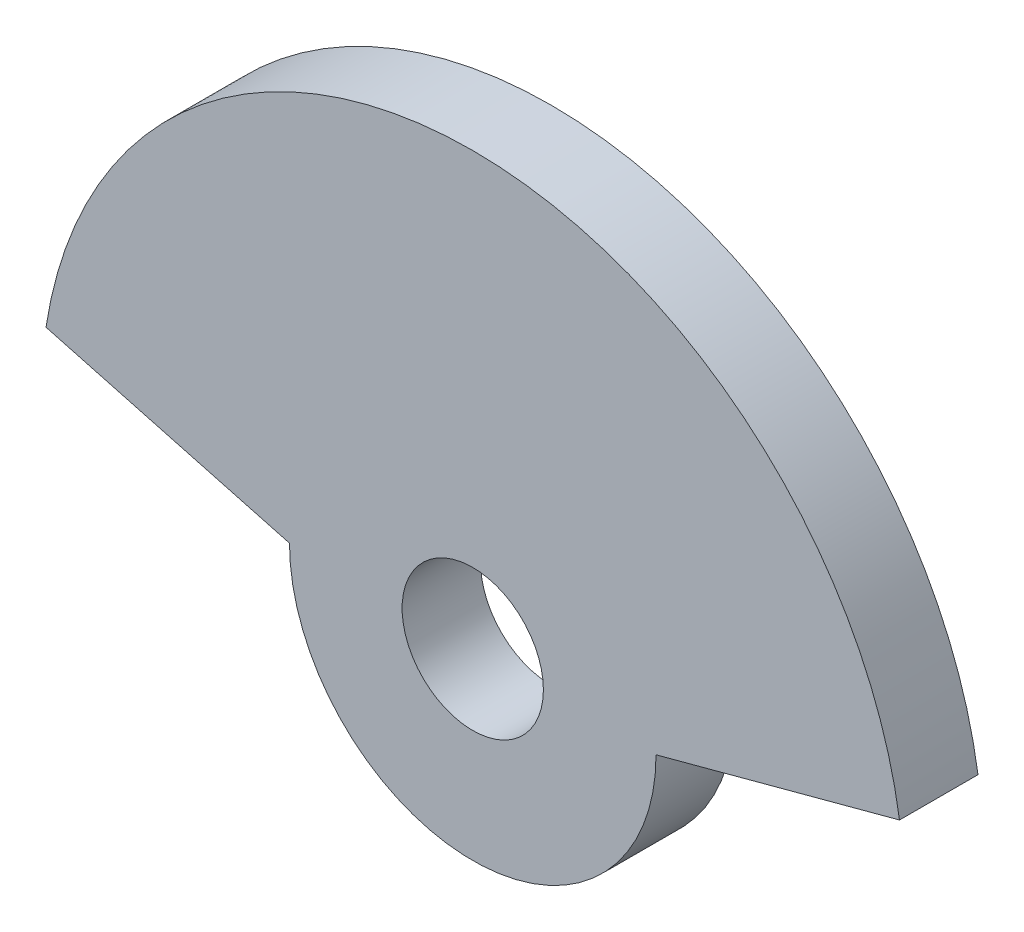
ISO-10303-21;
HEADER;
FILE_DESCRIPTION(('STEP AP214'),'2;1');
FILE_NAME('part.step','',(''),(''),'','','');
FILE_SCHEMA(('AUTOMOTIVE_DESIGN { 1 0 10303 214 1 1 1 1 }'));
ENDSEC;
DATA;
#1=APPLICATION_CONTEXT('core data for automotive mechanical design processes');
#2=APPLICATION_PROTOCOL_DEFINITION('international standard','automotive_design',2000,#1);
#3=PRODUCT_CONTEXT('',#1,'mechanical');
#4=PRODUCT('Part','Part','',(#3));
#5=PRODUCT_RELATED_PRODUCT_CATEGORY('part','',(#4));
#6=PRODUCT_DEFINITION_FORMATION('','',#4);
#7=PRODUCT_DEFINITION_CONTEXT('part definition',#1,'design');
#8=PRODUCT_DEFINITION('design','',#6,#7);
#9=PRODUCT_DEFINITION_SHAPE('','',#8);
#10=(LENGTH_UNIT() NAMED_UNIT(*) SI_UNIT(.MILLI.,.METRE.));
#11=(NAMED_UNIT(*) PLANE_ANGLE_UNIT() SI_UNIT($,.RADIAN.));
#12=(NAMED_UNIT(*) SI_UNIT($,.STERADIAN.) SOLID_ANGLE_UNIT());
#13=UNCERTAINTY_MEASURE_WITH_UNIT(LENGTH_MEASURE(1.E-05),#10,'distance_accuracy_value','');
#14=(GEOMETRIC_REPRESENTATION_CONTEXT(3) GLOBAL_UNCERTAINTY_ASSIGNED_CONTEXT((#13)) GLOBAL_UNIT_ASSIGNED_CONTEXT((#10,
#11,#12)) REPRESENTATION_CONTEXT('',''));
#15=CARTESIAN_POINT('',(0.,0.,0.));
#16=DIRECTION('',(0.,0.,1.));
#17=DIRECTION('',(1.,0.,0.));
#18=AXIS2_PLACEMENT_3D('',#15,#16,#17);
#19=CARTESIAN_POINT('',(0.,0.,10.));
#20=DIRECTION('',(0.,0.,1.));
#21=DIRECTION('',(1.,0.,0.));
#22=AXIS2_PLACEMENT_3D('',#19,#20,#21);
#23=PLANE('',#22);
#24=CARTESIAN_POINT('',(0.,0.,10.));
#25=DIRECTION('',(0.,0.,1.));
#26=DIRECTION('',(1.,0.,0.));
#27=AXIS2_PLACEMENT_3D('',#24,#25,#26);
#28=CIRCLE('',#27,23.35);
#29=CARTESIAN_POINT('',(-23.35,0.,10.));
#30=VERTEX_POINT('',#29);
#31=CARTESIAN_POINT('',(23.35,0.,10.));
#32=VERTEX_POINT('',#31);
#33=EDGE_CURVE('E88',#30,#32,#28,.T.);
#34=ORIENTED_EDGE('',*,*,#33,.T.);
#35=DIRECTION('',(0.965925826289069,0.258819045102518,0.));
#36=VECTOR('',#35,1.);
#37=CARTESIAN_POINT('',(23.35,0.,10.));
#38=LINE('',#37,#36);
#39=CARTESIAN_POINT('',(54.368386356424,8.31135157472027,10.));
#40=VERTEX_POINT('',#39);
#41=EDGE_CURVE('E83',#32,#40,#38,.T.);
#42=ORIENTED_EDGE('',*,*,#41,.T.);
#43=CARTESIAN_POINT('',(0.,0.,10.));
#44=DIRECTION('',(0.,0.,1.));
#45=DIRECTION('',(1.,0.,0.));
#46=AXIS2_PLACEMENT_3D('',#43,#44,#45);
#47=CIRCLE('',#46,55.);
#48=CARTESIAN_POINT('',(-54.368386356424,8.31135157472027,10.));
#49=VERTEX_POINT('',#48);
#50=EDGE_CURVE('E86',#40,#49,#47,.T.);
#51=ORIENTED_EDGE('',*,*,#50,.T.);
#52=DIRECTION('',(0.965925826289069,-0.258819045102518,0.));
#53=VECTOR('',#52,1.);
#54=CARTESIAN_POINT('',(-23.35,0.,10.));
#55=LINE('',#54,#53);
#56=EDGE_CURVE('E53',#49,#30,#55,.T.);
#57=ORIENTED_EDGE('',*,*,#56,.T.);
#58=EDGE_LOOP('',(#34,#42,#51,#57));
#59=FACE_BOUND('',#58,.T.);
#60=CARTESIAN_POINT('',(0.,0.,10.));
#61=DIRECTION('',(0.,0.,1.));
#62=DIRECTION('',(1.,0.,0.));
#63=AXIS2_PLACEMENT_3D('',#60,#61,#62);
#64=CIRCLE('',#63,9.);
#65=CARTESIAN_POINT('',(9.,0.,10.));
#66=VERTEX_POINT('',#65);
#67=EDGE_CURVE('E103',#66,#66,#64,.T.);
#68=ORIENTED_EDGE('',*,*,#67,.F.);
#69=EDGE_LOOP('',(#68));
#70=FACE_BOUND('',#69,.T.);
#71=ADVANCED_FACE('F36',(#59,#70),#23,.T.);
#72=CARTESIAN_POINT('',(0.,0.,0.));
#73=DIRECTION('',(0.,0.,1.));
#74=DIRECTION('',(1.,0.,0.));
#75=AXIS2_PLACEMENT_3D('',#72,#73,#74);
#76=PLANE('',#75);
#77=CARTESIAN_POINT('',(0.,0.,0.));
#78=DIRECTION('',(0.,0.,1.));
#79=DIRECTION('',(1.,0.,0.));
#80=AXIS2_PLACEMENT_3D('',#77,#78,#79);
#81=CIRCLE('',#80,23.35);
#82=CARTESIAN_POINT('',(-23.35,0.,0.));
#83=VERTEX_POINT('',#82);
#84=CARTESIAN_POINT('',(23.35,0.,0.));
#85=VERTEX_POINT('',#84);
#86=EDGE_CURVE('E100',#83,#85,#81,.T.);
#87=ORIENTED_EDGE('',*,*,#86,.F.);
#88=DIRECTION('',(0.965925826289069,-0.258819045102518,0.));
#89=VECTOR('',#88,1.);
#90=CARTESIAN_POINT('',(-23.35,0.,0.));
#91=LINE('',#90,#89);
#92=CARTESIAN_POINT('',(-54.368386356424,8.31135157472027,0.));
#93=VERTEX_POINT('',#92);
#94=EDGE_CURVE('E76',#93,#83,#91,.T.);
#95=ORIENTED_EDGE('',*,*,#94,.F.);
#96=CARTESIAN_POINT('',(0.,0.,0.));
#97=DIRECTION('',(0.,0.,1.));
#98=DIRECTION('',(1.,0.,0.));
#99=AXIS2_PLACEMENT_3D('',#96,#97,#98);
#100=CIRCLE('',#99,55.);
#101=CARTESIAN_POINT('',(54.368386356424,8.31135157472027,0.));
#102=VERTEX_POINT('',#101);
#103=EDGE_CURVE('E70',#102,#93,#100,.T.);
#104=ORIENTED_EDGE('',*,*,#103,.F.);
#105=DIRECTION('',(0.965925826289069,0.258819045102518,0.));
#106=VECTOR('',#105,1.);
#107=CARTESIAN_POINT('',(23.35,0.,0.));
#108=LINE('',#107,#106);
#109=EDGE_CURVE('E92',#85,#102,#108,.T.);
#110=ORIENTED_EDGE('',*,*,#109,.F.);
#111=EDGE_LOOP('',(#87,#95,#104,#110));
#112=FACE_BOUND('',#111,.T.);
#113=CARTESIAN_POINT('',(0.,0.,0.));
#114=DIRECTION('',(0.,0.,1.));
#115=DIRECTION('',(1.,0.,0.));
#116=AXIS2_PLACEMENT_3D('',#113,#114,#115);
#117=CIRCLE('',#116,9.);
#118=CARTESIAN_POINT('',(9.,0.,0.));
#119=VERTEX_POINT('',#118);
#120=EDGE_CURVE('E115',#119,#119,#117,.T.);
#121=ORIENTED_EDGE('',*,*,#120,.T.);
#122=EDGE_LOOP('',(#121));
#123=FACE_BOUND('',#122,.T.);
#124=ADVANCED_FACE('F111',(#112,#123),#76,.F.);
#125=CARTESIAN_POINT('',(0.,0.,10.));
#126=DIRECTION('',(0.,0.,-1.));
#127=DIRECTION('',(-1.,0.,0.));
#128=AXIS2_PLACEMENT_3D('',#125,#126,#127);
#129=CYLINDRICAL_SURFACE('',#128,23.35);
#130=ORIENTED_EDGE('',*,*,#86,.T.);
#131=DIRECTION('',(0.,0.,-1.));
#132=VECTOR('',#131,1.);
#133=CARTESIAN_POINT('',(23.35,0.,10.));
#134=LINE('',#133,#132);
#135=EDGE_CURVE('E11',#32,#85,#134,.T.);
#136=ORIENTED_EDGE('',*,*,#135,.F.);
#137=ORIENTED_EDGE('',*,*,#33,.F.);
#138=DIRECTION('',(0.,0.,-1.));
#139=VECTOR('',#138,1.);
#140=CARTESIAN_POINT('',(-23.35,0.,10.));
#141=LINE('',#140,#139);
#142=EDGE_CURVE('E96',#30,#83,#141,.T.);
#143=ORIENTED_EDGE('',*,*,#142,.T.);
#144=EDGE_LOOP('',(#130,#136,#137,#143));
#145=FACE_BOUND('',#144,.T.);
#146=ADVANCED_FACE('F38',(#145),#129,.T.);
#147=CARTESIAN_POINT('',(23.35,0.,10.));
#148=DIRECTION('',(-0.258819045102518,0.965925826289069,0.));
#149=DIRECTION('',(-0.965925826289069,-0.258819045102518,0.));
#150=AXIS2_PLACEMENT_3D('',#147,#148,#149);
#151=PLANE('',#150);
#152=ORIENTED_EDGE('',*,*,#109,.T.);
#153=DIRECTION('',(0.,0.,-1.));
#154=VECTOR('',#153,1.);
#155=CARTESIAN_POINT('',(54.368386356424,8.31135157472027,10.));
#156=LINE('',#155,#154);
#157=EDGE_CURVE('E45',#40,#102,#156,.T.);
#158=ORIENTED_EDGE('',*,*,#157,.F.);
#159=ORIENTED_EDGE('',*,*,#41,.F.);
#160=ORIENTED_EDGE('',*,*,#135,.T.);
#161=EDGE_LOOP('',(#152,#158,#159,#160));
#162=FACE_BOUND('',#161,.T.);
#163=ADVANCED_FACE('F91',(#162),#151,.F.);
#164=CARTESIAN_POINT('',(0.,0.,10.));
#165=DIRECTION('',(0.,0.,-1.));
#166=DIRECTION('',(-1.,0.,0.));
#167=AXIS2_PLACEMENT_3D('',#164,#165,#166);
#168=CYLINDRICAL_SURFACE('',#167,55.);
#169=ORIENTED_EDGE('',*,*,#103,.T.);
#170=DIRECTION('',(0.,0.,-1.));
#171=VECTOR('',#170,1.);
#172=CARTESIAN_POINT('',(-54.368386356424,8.31135157472027,10.));
#173=LINE('',#172,#171);
#174=EDGE_CURVE('E93',#49,#93,#173,.T.);
#175=ORIENTED_EDGE('',*,*,#174,.F.);
#176=ORIENTED_EDGE('',*,*,#50,.F.);
#177=ORIENTED_EDGE('',*,*,#157,.T.);
#178=EDGE_LOOP('',(#169,#175,#176,#177));
#179=FACE_BOUND('',#178,.T.);
#180=ADVANCED_FACE('F94',(#179),#168,.T.);
#181=CARTESIAN_POINT('',(-23.35,0.,10.));
#182=DIRECTION('',(0.258819045102518,0.965925826289069,0.));
#183=DIRECTION('',(-0.965925826289069,0.258819045102518,0.));
#184=AXIS2_PLACEMENT_3D('',#181,#182,#183);
#185=PLANE('',#184);
#186=ORIENTED_EDGE('',*,*,#94,.T.);
#187=ORIENTED_EDGE('',*,*,#142,.F.);
#188=ORIENTED_EDGE('',*,*,#56,.F.);
#189=ORIENTED_EDGE('',*,*,#174,.T.);
#190=EDGE_LOOP('',(#186,#187,#188,#189));
#191=FACE_BOUND('',#190,.T.);
#192=ADVANCED_FACE('F108',(#191),#185,.F.);
#193=CARTESIAN_POINT('',(0.,0.,10.));
#194=DIRECTION('',(0.,0.,-1.));
#195=DIRECTION('',(-1.,0.,0.));
#196=AXIS2_PLACEMENT_3D('',#193,#194,#195);
#197=CYLINDRICAL_SURFACE('',#196,9.);
#198=ORIENTED_EDGE('',*,*,#67,.T.);
#199=EDGE_LOOP('',(#198));
#200=FACE_BOUND('',#199,.T.);
#201=ORIENTED_EDGE('',*,*,#120,.F.);
#202=EDGE_LOOP('',(#201));
#203=FACE_BOUND('',#202,.T.);
#204=ADVANCED_FACE('F121',(#200,#203),#197,.F.);
#205=CLOSED_SHELL('',(#71,#124,#146,#163,#180,#192,#204));
#206=MANIFOLD_SOLID_BREP('B2',#205);
#207=ADVANCED_BREP_SHAPE_REPRESENTATION('',(#18,#206),#14);
#208=SHAPE_DEFINITION_REPRESENTATION(#9,#207);
ENDSEC;
END-ISO-10303-21;
